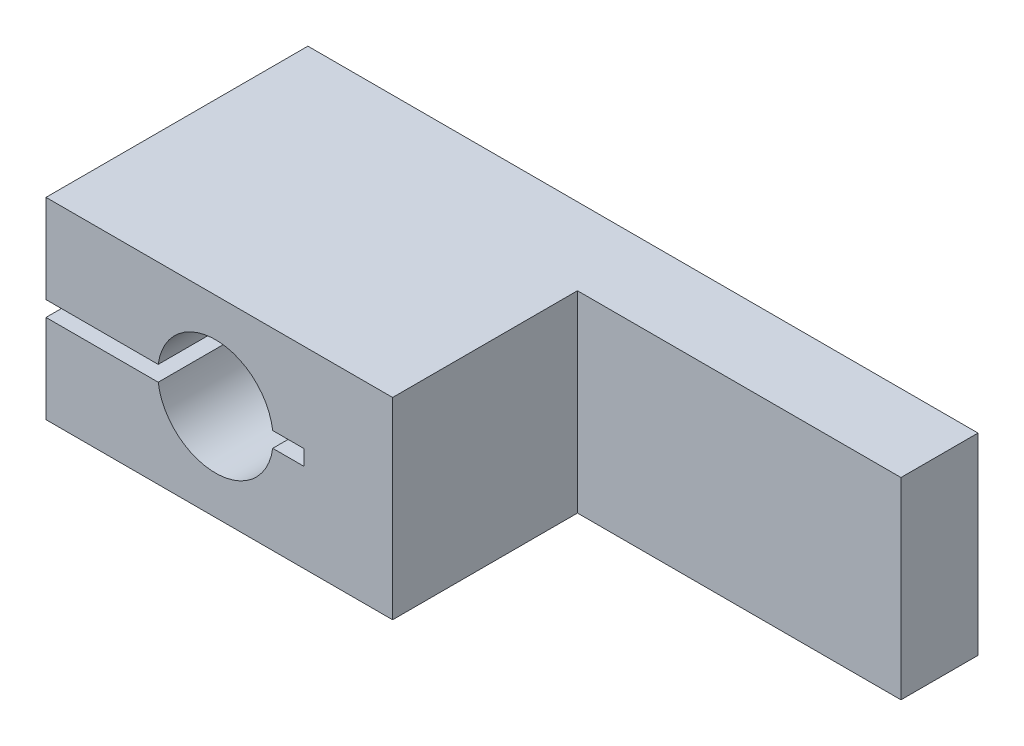
ISO-10303-21;
HEADER;
FILE_DESCRIPTION(('STEP AP214'),'2;1');
FILE_NAME('part.step','',(''),(''),'','','');
FILE_SCHEMA(('AUTOMOTIVE_DESIGN { 1 0 10303 214 1 1 1 1 }'));
ENDSEC;
DATA;
#1=APPLICATION_CONTEXT('core data for automotive mechanical design processes');
#2=APPLICATION_PROTOCOL_DEFINITION('international standard','automotive_design',2000,#1);
#3=PRODUCT_CONTEXT('',#1,'mechanical');
#4=PRODUCT('Part','Part','',(#3));
#5=PRODUCT_RELATED_PRODUCT_CATEGORY('part','',(#4));
#6=PRODUCT_DEFINITION_FORMATION('','',#4);
#7=PRODUCT_DEFINITION_CONTEXT('part definition',#1,'design');
#8=PRODUCT_DEFINITION('design','',#6,#7);
#9=PRODUCT_DEFINITION_SHAPE('','',#8);
#10=(LENGTH_UNIT() NAMED_UNIT(*) SI_UNIT(.MILLI.,.METRE.));
#11=(NAMED_UNIT(*) PLANE_ANGLE_UNIT() SI_UNIT($,.RADIAN.));
#12=(NAMED_UNIT(*) SI_UNIT($,.STERADIAN.) SOLID_ANGLE_UNIT());
#13=UNCERTAINTY_MEASURE_WITH_UNIT(LENGTH_MEASURE(1.E-05),#10,'distance_accuracy_value','');
#14=(GEOMETRIC_REPRESENTATION_CONTEXT(3) GLOBAL_UNCERTAINTY_ASSIGNED_CONTEXT((#13)) GLOBAL_UNIT_ASSIGNED_CONTEXT((#10,
#11,#12)) REPRESENTATION_CONTEXT('',''));
#15=CARTESIAN_POINT('',(0.,0.,0.));
#16=DIRECTION('',(0.,0.,1.));
#17=DIRECTION('',(1.,0.,0.));
#18=AXIS2_PLACEMENT_3D('',#15,#16,#17);
#19=CARTESIAN_POINT('',(-22.,-12.5,-34.));
#20=DIRECTION('',(0.,-1.,0.));
#21=DIRECTION('',(1.,0.,0.));
#22=AXIS2_PLACEMENT_3D('',#19,#20,#21);
#23=PLANE('',#22);
#24=DIRECTION('',(1.,0.,0.));
#25=VECTOR('',#24,1.);
#26=CARTESIAN_POINT('',(65.,-12.5,-24.));
#27=LINE('',#26,#25);
#28=CARTESIAN_POINT('',(23.,-12.5,-24.));
#29=VERTEX_POINT('',#28);
#30=CARTESIAN_POINT('',(65.,-12.5,-24.));
#31=VERTEX_POINT('',#30);
#32=EDGE_CURVE('E215',#29,#31,#27,.T.);
#33=ORIENTED_EDGE('',*,*,#32,.F.);
#34=DIRECTION('',(0.,0.,-1.));
#35=VECTOR('',#34,1.);
#36=CARTESIAN_POINT('',(23.,-12.5,0.));
#37=LINE('',#36,#35);
#38=CARTESIAN_POINT('',(23.,-12.5,0.));
#39=VERTEX_POINT('',#38);
#40=EDGE_CURVE('E236',#39,#29,#37,.T.);
#41=ORIENTED_EDGE('',*,*,#40,.F.);
#42=DIRECTION('',(1.,0.,0.));
#43=VECTOR('',#42,1.);
#44=CARTESIAN_POINT('',(-22.,-12.5,0.));
#45=LINE('',#44,#43);
#46=CARTESIAN_POINT('',(-22.,-12.5,0.));
#47=VERTEX_POINT('',#46);
#48=EDGE_CURVE('E163',#47,#39,#45,.T.);
#49=ORIENTED_EDGE('',*,*,#48,.F.);
#50=DIRECTION('',(0.,0.,1.));
#51=VECTOR('',#50,1.);
#52=CARTESIAN_POINT('',(-22.,-12.5,-34.));
#53=LINE('',#52,#51);
#54=CARTESIAN_POINT('',(-22.,-12.5,-34.));
#55=VERTEX_POINT('',#54);
#56=EDGE_CURVE('E11',#55,#47,#53,.T.);
#57=ORIENTED_EDGE('',*,*,#56,.F.);
#58=DIRECTION('',(1.,0.,0.));
#59=VECTOR('',#58,1.);
#60=CARTESIAN_POINT('',(-22.,-12.5,-34.));
#61=LINE('',#60,#59);
#62=CARTESIAN_POINT('',(65.,-12.5,-34.));
#63=VERTEX_POINT('',#62);
#64=EDGE_CURVE('E192',#55,#63,#61,.T.);
#65=ORIENTED_EDGE('',*,*,#64,.T.);
#66=DIRECTION('',(0.,0.,1.));
#67=VECTOR('',#66,1.);
#68=CARTESIAN_POINT('',(65.,-12.5,-34.));
#69=LINE('',#68,#67);
#70=EDGE_CURVE('E38',#63,#31,#69,.T.);
#71=ORIENTED_EDGE('',*,*,#70,.T.);
#72=EDGE_LOOP('',(#33,#41,#49,#57,#65,#71));
#73=FACE_BOUND('',#72,.T.);
#74=ADVANCED_FACE('F35',(#73),#23,.T.);
#75=CARTESIAN_POINT('',(-22.,-1.,-34.));
#76=DIRECTION('',(-1.,0.,0.));
#77=DIRECTION('',(0.,0.,1.));
#78=AXIS2_PLACEMENT_3D('',#75,#76,#77);
#79=PLANE('',#78);
#80=DIRECTION('',(0.,-1.,0.));
#81=VECTOR('',#80,1.);
#82=CARTESIAN_POINT('',(-22.,-1.,0.));
#83=LINE('',#82,#81);
#84=CARTESIAN_POINT('',(-22.,-1.,0.));
#85=VERTEX_POINT('',#84);
#86=EDGE_CURVE('E190',#85,#47,#83,.T.);
#87=ORIENTED_EDGE('',*,*,#86,.F.);
#88=DIRECTION('',(0.,0.,1.));
#89=VECTOR('',#88,1.);
#90=CARTESIAN_POINT('',(-22.,-1.,-34.));
#91=LINE('',#90,#89);
#92=CARTESIAN_POINT('',(-22.,-1.,-34.));
#93=VERTEX_POINT('',#92);
#94=EDGE_CURVE('E43',#93,#85,#91,.T.);
#95=ORIENTED_EDGE('',*,*,#94,.F.);
#96=DIRECTION('',(0.,-1.,0.));
#97=VECTOR('',#96,1.);
#98=CARTESIAN_POINT('',(-22.,-1.,-34.));
#99=LINE('',#98,#97);
#100=EDGE_CURVE('E153',#93,#55,#99,.T.);
#101=ORIENTED_EDGE('',*,*,#100,.T.);
#102=ORIENTED_EDGE('',*,*,#56,.T.);
#103=EDGE_LOOP('',(#87,#95,#101,#102));
#104=FACE_BOUND('',#103,.T.);
#105=ADVANCED_FACE('F286',(#104),#79,.T.);
#106=CARTESIAN_POINT('',(-22.,-1.,-34.));
#107=DIRECTION('',(0.,1.,0.));
#108=DIRECTION('',(0.,0.,1.));
#109=AXIS2_PLACEMENT_3D('',#106,#107,#108);
#110=PLANE('',#109);
#111=DIRECTION('',(-1.,0.,0.));
#112=VECTOR('',#111,1.);
#113=CARTESIAN_POINT('',(-22.,-1.,0.));
#114=LINE('',#113,#112);
#115=CARTESIAN_POINT('',(-7.43303437365925,-1.,0.));
#116=VERTEX_POINT('',#115);
#117=EDGE_CURVE('E140',#116,#85,#114,.T.);
#118=ORIENTED_EDGE('',*,*,#117,.F.);
#119=DIRECTION('',(0.,0.,1.));
#120=VECTOR('',#119,1.);
#121=CARTESIAN_POINT('',(-7.43303437365925,-1.,-34.));
#122=LINE('',#121,#120);
#123=CARTESIAN_POINT('',(-7.43303437365925,-1.,-34.));
#124=VERTEX_POINT('',#123);
#125=EDGE_CURVE('E134',#124,#116,#122,.T.);
#126=ORIENTED_EDGE('',*,*,#125,.F.);
#127=DIRECTION('',(-1.,0.,0.));
#128=VECTOR('',#127,1.);
#129=CARTESIAN_POINT('',(-22.,-1.,-34.));
#130=LINE('',#129,#128);
#131=EDGE_CURVE('E137',#124,#93,#130,.T.);
#132=ORIENTED_EDGE('',*,*,#131,.T.);
#133=ORIENTED_EDGE('',*,*,#94,.T.);
#134=EDGE_LOOP('',(#118,#126,#132,#133));
#135=FACE_BOUND('',#134,.T.);
#136=ADVANCED_FACE('F136',(#135),#110,.T.);
#137=CARTESIAN_POINT('',(0.,0.,-34.));
#138=DIRECTION('',(0.,0.,1.));
#139=DIRECTION('',(1.,0.,0.));
#140=AXIS2_PLACEMENT_3D('',#137,#138,#139);
#141=CYLINDRICAL_SURFACE('',#140,7.5);
#142=CARTESIAN_POINT('',(0.,0.,0.));
#143=DIRECTION('',(0.,0.,-1.));
#144=DIRECTION('',(1.,0.,0.));
#145=AXIS2_PLACEMENT_3D('',#142,#143,#144);
#146=CIRCLE('',#145,7.5);
#147=CARTESIAN_POINT('',(7.43303437365925,-1.,0.));
#148=VERTEX_POINT('',#147);
#149=EDGE_CURVE('E187',#148,#116,#146,.T.);
#150=ORIENTED_EDGE('',*,*,#149,.F.);
#151=DIRECTION('',(0.,0.,1.));
#152=VECTOR('',#151,1.);
#153=CARTESIAN_POINT('',(7.43303437365925,-1.,-34.));
#154=LINE('',#153,#152);
#155=CARTESIAN_POINT('',(7.43303437365925,-1.,-34.));
#156=VERTEX_POINT('',#155);
#157=EDGE_CURVE('E145',#156,#148,#154,.T.);
#158=ORIENTED_EDGE('',*,*,#157,.F.);
#159=CARTESIAN_POINT('',(0.,0.,-34.));
#160=DIRECTION('',(0.,0.,-1.));
#161=DIRECTION('',(1.,0.,0.));
#162=AXIS2_PLACEMENT_3D('',#159,#160,#161);
#163=CIRCLE('',#162,7.5);
#164=EDGE_CURVE('E151',#156,#124,#163,.T.);
#165=ORIENTED_EDGE('',*,*,#164,.T.);
#166=ORIENTED_EDGE('',*,*,#125,.T.);
#167=EDGE_LOOP('',(#150,#158,#165,#166));
#168=FACE_BOUND('',#167,.T.);
#169=ADVANCED_FACE('F155',(#168),#141,.F.);
#170=CARTESIAN_POINT('',(7.43303437365925,-0.999999999999996,-34.));
#171=DIRECTION('',(0.,1.,0.));
#172=DIRECTION('',(0.,0.,1.));
#173=AXIS2_PLACEMENT_3D('',#170,#171,#172);
#174=PLANE('',#173);
#175=DIRECTION('',(-1.,0.,0.));
#176=VECTOR('',#175,1.);
#177=CARTESIAN_POINT('',(7.43303437365925,-0.999999999999996,0.));
#178=LINE('',#177,#176);
#179=CARTESIAN_POINT('',(11.5,-0.999999999999996,0.));
#180=VERTEX_POINT('',#179);
#181=EDGE_CURVE('E184',#180,#148,#178,.T.);
#182=ORIENTED_EDGE('',*,*,#181,.F.);
#183=DIRECTION('',(0.,0.,1.));
#184=VECTOR('',#183,1.);
#185=CARTESIAN_POINT('',(11.5,-0.999999999999996,-34.));
#186=LINE('',#185,#184);
#187=CARTESIAN_POINT('',(11.5,-0.999999999999996,-34.));
#188=VERTEX_POINT('',#187);
#189=EDGE_CURVE('E196',#188,#180,#186,.T.);
#190=ORIENTED_EDGE('',*,*,#189,.F.);
#191=DIRECTION('',(-1.,0.,0.));
#192=VECTOR('',#191,1.);
#193=CARTESIAN_POINT('',(7.43303437365925,-0.999999999999996,-34.));
#194=LINE('',#193,#192);
#195=EDGE_CURVE('E156',#188,#156,#194,.T.);
#196=ORIENTED_EDGE('',*,*,#195,.T.);
#197=ORIENTED_EDGE('',*,*,#157,.T.);
#198=EDGE_LOOP('',(#182,#190,#196,#197));
#199=FACE_BOUND('',#198,.T.);
#200=ADVANCED_FACE('F299',(#199),#174,.T.);
#201=CARTESIAN_POINT('',(11.5,1.,-34.));
#202=DIRECTION('',(-1.,0.,0.));
#203=DIRECTION('',(0.,0.,1.));
#204=AXIS2_PLACEMENT_3D('',#201,#202,#203);
#205=PLANE('',#204);
#206=DIRECTION('',(0.,-1.,0.));
#207=VECTOR('',#206,1.);
#208=CARTESIAN_POINT('',(11.5,1.,0.));
#209=LINE('',#208,#207);
#210=CARTESIAN_POINT('',(11.5,1.,0.));
#211=VERTEX_POINT('',#210);
#212=EDGE_CURVE('E181',#211,#180,#209,.T.);
#213=ORIENTED_EDGE('',*,*,#212,.F.);
#214=DIRECTION('',(0.,0.,1.));
#215=VECTOR('',#214,1.);
#216=CARTESIAN_POINT('',(11.5,1.,-34.));
#217=LINE('',#216,#215);
#218=CARTESIAN_POINT('',(11.5,1.,-34.));
#219=VERTEX_POINT('',#218);
#220=EDGE_CURVE('E198',#219,#211,#217,.T.);
#221=ORIENTED_EDGE('',*,*,#220,.F.);
#222=DIRECTION('',(0.,-1.,0.));
#223=VECTOR('',#222,1.);
#224=CARTESIAN_POINT('',(11.5,1.,-34.));
#225=LINE('',#224,#223);
#226=EDGE_CURVE('E158',#219,#188,#225,.T.);
#227=ORIENTED_EDGE('',*,*,#226,.T.);
#228=ORIENTED_EDGE('',*,*,#189,.T.);
#229=EDGE_LOOP('',(#213,#221,#227,#228));
#230=FACE_BOUND('',#229,.T.);
#231=ADVANCED_FACE('F265',(#230),#205,.T.);
#232=CARTESIAN_POINT('',(7.43303437365925,1.,-34.));
#233=DIRECTION('',(0.,-1.,0.));
#234=DIRECTION('',(0.,0.,-1.));
#235=AXIS2_PLACEMENT_3D('',#232,#233,#234);
#236=PLANE('',#235);
#237=DIRECTION('',(1.,0.,0.));
#238=VECTOR('',#237,1.);
#239=CARTESIAN_POINT('',(7.43303437365925,1.,0.));
#240=LINE('',#239,#238);
#241=CARTESIAN_POINT('',(7.43303437365925,1.,0.));
#242=VERTEX_POINT('',#241);
#243=EDGE_CURVE('E178',#242,#211,#240,.T.);
#244=ORIENTED_EDGE('',*,*,#243,.F.);
#245=DIRECTION('',(0.,0.,1.));
#246=VECTOR('',#245,1.);
#247=CARTESIAN_POINT('',(7.43303437365925,1.,-34.));
#248=LINE('',#247,#246);
#249=CARTESIAN_POINT('',(7.43303437365925,1.,-34.));
#250=VERTEX_POINT('',#249);
#251=EDGE_CURVE('E200',#250,#242,#248,.T.);
#252=ORIENTED_EDGE('',*,*,#251,.F.);
#253=DIRECTION('',(1.,0.,0.));
#254=VECTOR('',#253,1.);
#255=CARTESIAN_POINT('',(7.43303437365925,1.,-34.));
#256=LINE('',#255,#254);
#257=EDGE_CURVE('E259',#250,#219,#256,.T.);
#258=ORIENTED_EDGE('',*,*,#257,.T.);
#259=ORIENTED_EDGE('',*,*,#220,.T.);
#260=EDGE_LOOP('',(#244,#252,#258,#259));
#261=FACE_BOUND('',#260,.T.);
#262=ADVANCED_FACE('F271',(#261),#236,.T.);
#263=CARTESIAN_POINT('',(0.,0.,-34.));
#264=DIRECTION('',(0.,0.,1.));
#265=DIRECTION('',(1.,0.,0.));
#266=AXIS2_PLACEMENT_3D('',#263,#264,#265);
#267=CYLINDRICAL_SURFACE('',#266,7.5);
#268=CARTESIAN_POINT('',(0.,0.,0.));
#269=DIRECTION('',(0.,0.,-1.));
#270=DIRECTION('',(1.,0.,0.));
#271=AXIS2_PLACEMENT_3D('',#268,#269,#270);
#272=CIRCLE('',#271,7.5);
#273=CARTESIAN_POINT('',(-7.43303437365925,1.,0.));
#274=VERTEX_POINT('',#273);
#275=EDGE_CURVE('E175',#274,#242,#272,.T.);
#276=ORIENTED_EDGE('',*,*,#275,.F.);
#277=DIRECTION('',(0.,0.,1.));
#278=VECTOR('',#277,1.);
#279=CARTESIAN_POINT('',(-7.43303437365925,1.,-34.));
#280=LINE('',#279,#278);
#281=CARTESIAN_POINT('',(-7.43303437365925,1.,-34.));
#282=VERTEX_POINT('',#281);
#283=EDGE_CURVE('E202',#282,#274,#280,.T.);
#284=ORIENTED_EDGE('',*,*,#283,.F.);
#285=CARTESIAN_POINT('',(0.,0.,-34.));
#286=DIRECTION('',(0.,0.,-1.));
#287=DIRECTION('',(1.,0.,0.));
#288=AXIS2_PLACEMENT_3D('',#285,#286,#287);
#289=CIRCLE('',#288,7.5);
#290=EDGE_CURVE('E256',#282,#250,#289,.T.);
#291=ORIENTED_EDGE('',*,*,#290,.T.);
#292=ORIENTED_EDGE('',*,*,#251,.T.);
#293=EDGE_LOOP('',(#276,#284,#291,#292));
#294=FACE_BOUND('',#293,.T.);
#295=ADVANCED_FACE('F274',(#294),#267,.F.);
#296=CARTESIAN_POINT('',(-22.,1.,-34.));
#297=DIRECTION('',(0.,-1.,0.));
#298=DIRECTION('',(0.,0.,-1.));
#299=AXIS2_PLACEMENT_3D('',#296,#297,#298);
#300=PLANE('',#299);
#301=DIRECTION('',(1.,0.,0.));
#302=VECTOR('',#301,1.);
#303=CARTESIAN_POINT('',(-22.,1.,0.));
#304=LINE('',#303,#302);
#305=CARTESIAN_POINT('',(-22.,1.,0.));
#306=VERTEX_POINT('',#305);
#307=EDGE_CURVE('E172',#306,#274,#304,.T.);
#308=ORIENTED_EDGE('',*,*,#307,.F.);
#309=DIRECTION('',(0.,0.,1.));
#310=VECTOR('',#309,1.);
#311=CARTESIAN_POINT('',(-22.,1.,-34.));
#312=LINE('',#311,#310);
#313=CARTESIAN_POINT('',(-22.,1.,-34.));
#314=VERTEX_POINT('',#313);
#315=EDGE_CURVE('E204',#314,#306,#312,.T.);
#316=ORIENTED_EDGE('',*,*,#315,.F.);
#317=DIRECTION('',(1.,0.,0.));
#318=VECTOR('',#317,1.);
#319=CARTESIAN_POINT('',(-22.,1.,-34.));
#320=LINE('',#319,#318);
#321=EDGE_CURVE('E253',#314,#282,#320,.T.);
#322=ORIENTED_EDGE('',*,*,#321,.T.);
#323=ORIENTED_EDGE('',*,*,#283,.T.);
#324=EDGE_LOOP('',(#308,#316,#322,#323));
#325=FACE_BOUND('',#324,.T.);
#326=ADVANCED_FACE('F279',(#325),#300,.T.);
#327=CARTESIAN_POINT('',(-22.,12.5,-34.));
#328=DIRECTION('',(-1.,0.,0.));
#329=DIRECTION('',(0.,-1.,0.));
#330=AXIS2_PLACEMENT_3D('',#327,#328,#329);
#331=PLANE('',#330);
#332=DIRECTION('',(0.,-1.,0.));
#333=VECTOR('',#332,1.);
#334=CARTESIAN_POINT('',(-22.,12.5,0.));
#335=LINE('',#334,#333);
#336=CARTESIAN_POINT('',(-22.,12.5,0.));
#337=VERTEX_POINT('',#336);
#338=EDGE_CURVE('E169',#337,#306,#335,.T.);
#339=ORIENTED_EDGE('',*,*,#338,.F.);
#340=DIRECTION('',(0.,0.,1.));
#341=VECTOR('',#340,1.);
#342=CARTESIAN_POINT('',(-22.,12.5,-34.));
#343=LINE('',#342,#341);
#344=CARTESIAN_POINT('',(-22.,12.5,-34.));
#345=VERTEX_POINT('',#344);
#346=EDGE_CURVE('E206',#345,#337,#343,.T.);
#347=ORIENTED_EDGE('',*,*,#346,.F.);
#348=DIRECTION('',(0.,-1.,0.));
#349=VECTOR('',#348,1.);
#350=CARTESIAN_POINT('',(-22.,12.5,-34.));
#351=LINE('',#350,#349);
#352=EDGE_CURVE('E250',#345,#314,#351,.T.);
#353=ORIENTED_EDGE('',*,*,#352,.T.);
#354=ORIENTED_EDGE('',*,*,#315,.T.);
#355=EDGE_LOOP('',(#339,#347,#353,#354));
#356=FACE_BOUND('',#355,.T.);
#357=ADVANCED_FACE('F282',(#356),#331,.T.);
#358=CARTESIAN_POINT('',(65.,12.5,-34.));
#359=DIRECTION('',(0.,1.,0.));
#360=DIRECTION('',(-1.,0.,0.));
#361=AXIS2_PLACEMENT_3D('',#358,#359,#360);
#362=PLANE('',#361);
#363=DIRECTION('',(1.,0.,0.));
#364=VECTOR('',#363,1.);
#365=CARTESIAN_POINT('',(65.,12.5,-24.));
#366=LINE('',#365,#364);
#367=CARTESIAN_POINT('',(23.,12.5,-24.));
#368=VERTEX_POINT('',#367);
#369=CARTESIAN_POINT('',(65.,12.5,-24.));
#370=VERTEX_POINT('',#369);
#371=EDGE_CURVE('E229',#368,#370,#366,.T.);
#372=ORIENTED_EDGE('',*,*,#371,.T.);
#373=DIRECTION('',(0.,0.,1.));
#374=VECTOR('',#373,1.);
#375=CARTESIAN_POINT('',(65.,12.5,-34.));
#376=LINE('',#375,#374);
#377=CARTESIAN_POINT('',(65.,12.5,-34.));
#378=VERTEX_POINT('',#377);
#379=EDGE_CURVE('E208',#378,#370,#376,.T.);
#380=ORIENTED_EDGE('',*,*,#379,.F.);
#381=DIRECTION('',(-1.,0.,0.));
#382=VECTOR('',#381,1.);
#383=CARTESIAN_POINT('',(65.,12.5,-34.));
#384=LINE('',#383,#382);
#385=EDGE_CURVE('E248',#378,#345,#384,.T.);
#386=ORIENTED_EDGE('',*,*,#385,.T.);
#387=ORIENTED_EDGE('',*,*,#346,.T.);
#388=DIRECTION('',(-1.,0.,0.));
#389=VECTOR('',#388,1.);
#390=CARTESIAN_POINT('',(65.,12.5,0.));
#391=LINE('',#390,#389);
#392=CARTESIAN_POINT('',(23.,12.5,0.));
#393=VERTEX_POINT('',#392);
#394=EDGE_CURVE('E166',#393,#337,#391,.T.);
#395=ORIENTED_EDGE('',*,*,#394,.F.);
#396=DIRECTION('',(0.,0.,-1.));
#397=VECTOR('',#396,1.);
#398=CARTESIAN_POINT('',(23.,12.5,0.));
#399=LINE('',#398,#397);
#400=EDGE_CURVE('E51',#393,#368,#399,.T.);
#401=ORIENTED_EDGE('',*,*,#400,.T.);
#402=EDGE_LOOP('',(#372,#380,#386,#387,#395,#401));
#403=FACE_BOUND('',#402,.T.);
#404=ADVANCED_FACE('F232',(#403),#362,.T.);
#405=CARTESIAN_POINT('',(65.,12.5,-34.));
#406=DIRECTION('',(1.,0.,0.));
#407=DIRECTION('',(0.,0.,-1.));
#408=AXIS2_PLACEMENT_3D('',#405,#406,#407);
#409=PLANE('',#408);
#410=DIRECTION('',(0.,-1.,0.));
#411=VECTOR('',#410,1.);
#412=CARTESIAN_POINT('',(65.,12.501,-24.));
#413=LINE('',#412,#411);
#414=EDGE_CURVE('E167',#370,#31,#413,.T.);
#415=ORIENTED_EDGE('',*,*,#414,.T.);
#416=ORIENTED_EDGE('',*,*,#70,.F.);
#417=DIRECTION('',(0.,1.,0.));
#418=VECTOR('',#417,1.);
#419=CARTESIAN_POINT('',(65.,12.5,-34.));
#420=LINE('',#419,#418);
#421=EDGE_CURVE('E246',#63,#378,#420,.T.);
#422=ORIENTED_EDGE('',*,*,#421,.T.);
#423=ORIENTED_EDGE('',*,*,#379,.T.);
#424=EDGE_LOOP('',(#415,#416,#422,#423));
#425=FACE_BOUND('',#424,.T.);
#426=ADVANCED_FACE('F314',(#425),#409,.T.);
#427=CARTESIAN_POINT('',(0.,0.,-34.));
#428=DIRECTION('',(0.,0.,1.));
#429=DIRECTION('',(1.,0.,0.));
#430=AXIS2_PLACEMENT_3D('',#427,#428,#429);
#431=PLANE('',#430);
#432=ORIENTED_EDGE('',*,*,#64,.F.);
#433=ORIENTED_EDGE('',*,*,#100,.F.);
#434=ORIENTED_EDGE('',*,*,#131,.F.);
#435=ORIENTED_EDGE('',*,*,#164,.F.);
#436=ORIENTED_EDGE('',*,*,#195,.F.);
#437=ORIENTED_EDGE('',*,*,#226,.F.);
#438=ORIENTED_EDGE('',*,*,#257,.F.);
#439=ORIENTED_EDGE('',*,*,#290,.F.);
#440=ORIENTED_EDGE('',*,*,#321,.F.);
#441=ORIENTED_EDGE('',*,*,#352,.F.);
#442=ORIENTED_EDGE('',*,*,#385,.F.);
#443=ORIENTED_EDGE('',*,*,#421,.F.);
#444=EDGE_LOOP('',(#432,#433,#434,#435,#436,#437,#438,#439,#440,#441,#442,#443));
#445=FACE_BOUND('',#444,.T.);
#446=ADVANCED_FACE('F149',(#445),#431,.F.);
#447=CARTESIAN_POINT('',(0.,0.,0.));
#448=DIRECTION('',(0.,0.,1.));
#449=DIRECTION('',(1.,0.,0.));
#450=AXIS2_PLACEMENT_3D('',#447,#448,#449);
#451=PLANE('',#450);
#452=DIRECTION('',(0.,-1.,0.));
#453=VECTOR('',#452,1.);
#454=CARTESIAN_POINT('',(23.,12.501,0.));
#455=LINE('',#454,#453);
#456=EDGE_CURVE('E241',#393,#39,#455,.T.);
#457=ORIENTED_EDGE('',*,*,#456,.F.);
#458=ORIENTED_EDGE('',*,*,#394,.T.);
#459=ORIENTED_EDGE('',*,*,#338,.T.);
#460=ORIENTED_EDGE('',*,*,#307,.T.);
#461=ORIENTED_EDGE('',*,*,#275,.T.);
#462=ORIENTED_EDGE('',*,*,#243,.T.);
#463=ORIENTED_EDGE('',*,*,#212,.T.);
#464=ORIENTED_EDGE('',*,*,#181,.T.);
#465=ORIENTED_EDGE('',*,*,#149,.T.);
#466=ORIENTED_EDGE('',*,*,#117,.T.);
#467=ORIENTED_EDGE('',*,*,#86,.T.);
#468=ORIENTED_EDGE('',*,*,#48,.T.);
#469=EDGE_LOOP('',(#457,#458,#459,#460,#461,#462,#463,#464,#465,#466,#467,#468));
#470=FACE_BOUND('',#469,.T.);
#471=ADVANCED_FACE('F284',(#470),#451,.T.);
#472=CARTESIAN_POINT('',(65.,12.501,-24.));
#473=DIRECTION('',(0.,0.,-1.));
#474=DIRECTION('',(-1.,0.,0.));
#475=AXIS2_PLACEMENT_3D('',#472,#473,#474);
#476=PLANE('',#475);
#477=DIRECTION('',(0.,-1.,0.));
#478=VECTOR('',#477,1.);
#479=CARTESIAN_POINT('',(23.,12.501,-24.));
#480=LINE('',#479,#478);
#481=EDGE_CURVE('E221',#368,#29,#480,.T.);
#482=ORIENTED_EDGE('',*,*,#481,.T.);
#483=ORIENTED_EDGE('',*,*,#32,.T.);
#484=ORIENTED_EDGE('',*,*,#414,.F.);
#485=ORIENTED_EDGE('',*,*,#371,.F.);
#486=EDGE_LOOP('',(#482,#483,#484,#485));
#487=FACE_BOUND('',#486,.T.);
#488=ADVANCED_FACE('F228',(#487),#476,.F.);
#489=CARTESIAN_POINT('',(23.,12.501,0.));
#490=DIRECTION('',(-1.,0.,0.));
#491=DIRECTION('',(0.,0.,1.));
#492=AXIS2_PLACEMENT_3D('',#489,#490,#491);
#493=PLANE('',#492);
#494=ORIENTED_EDGE('',*,*,#456,.T.);
#495=ORIENTED_EDGE('',*,*,#40,.T.);
#496=ORIENTED_EDGE('',*,*,#481,.F.);
#497=ORIENTED_EDGE('',*,*,#400,.F.);
#498=EDGE_LOOP('',(#494,#495,#496,#497));
#499=FACE_BOUND('',#498,.T.);
#500=ADVANCED_FACE('F285',(#499),#493,.F.);
#501=CLOSED_SHELL('',(#74,#105,#136,#169,#200,#231,#262,#295,#326,#357,#404,#426,#446,#471,#488,#500));
#502=MANIFOLD_SOLID_BREP('B2',#501);
#503=ADVANCED_BREP_SHAPE_REPRESENTATION('',(#18,#502),#14);
#504=SHAPE_DEFINITION_REPRESENTATION(#9,#503);
ENDSEC;
END-ISO-10303-21;
